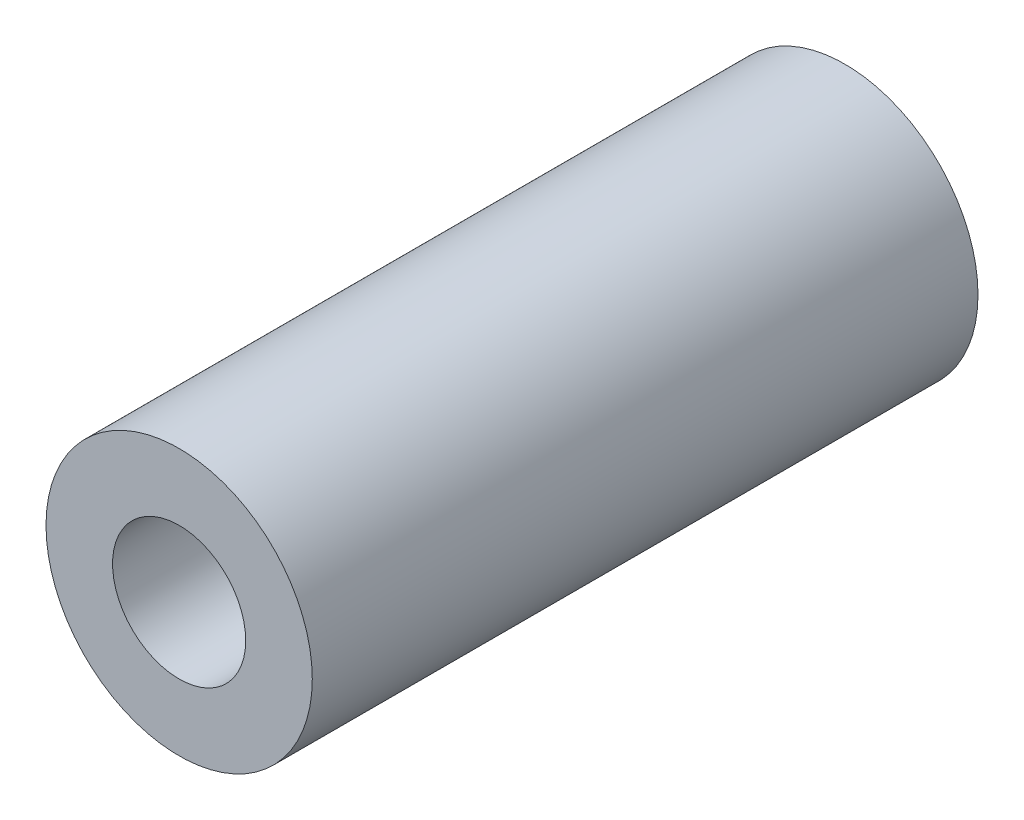
ISO-10303-21;
HEADER;
FILE_DESCRIPTION(('STEP AP214'),'2;1');
FILE_NAME('part.step','',(''),(''),'','','');
FILE_SCHEMA(('AUTOMOTIVE_DESIGN { 1 0 10303 214 1 1 1 1 }'));
ENDSEC;
DATA;
#1=APPLICATION_CONTEXT('core data for automotive mechanical design processes');
#2=APPLICATION_PROTOCOL_DEFINITION('international standard','automotive_design',2000,#1);
#3=PRODUCT_CONTEXT('',#1,'mechanical');
#4=PRODUCT('Part','Part','',(#3));
#5=PRODUCT_RELATED_PRODUCT_CATEGORY('part','',(#4));
#6=PRODUCT_DEFINITION_FORMATION('','',#4);
#7=PRODUCT_DEFINITION_CONTEXT('part definition',#1,'design');
#8=PRODUCT_DEFINITION('design','',#6,#7);
#9=PRODUCT_DEFINITION_SHAPE('','',#8);
#10=(LENGTH_UNIT() NAMED_UNIT(*) SI_UNIT(.MILLI.,.METRE.));
#11=(NAMED_UNIT(*) PLANE_ANGLE_UNIT() SI_UNIT($,.RADIAN.));
#12=(NAMED_UNIT(*) SI_UNIT($,.STERADIAN.) SOLID_ANGLE_UNIT());
#13=UNCERTAINTY_MEASURE_WITH_UNIT(LENGTH_MEASURE(1.E-05),#10,'distance_accuracy_value','');
#14=(GEOMETRIC_REPRESENTATION_CONTEXT(3) GLOBAL_UNCERTAINTY_ASSIGNED_CONTEXT((#13)) GLOBAL_UNIT_ASSIGNED_CONTEXT((#10,
#11,#12)) REPRESENTATION_CONTEXT('',''));
#15=CARTESIAN_POINT('',(0.,0.,0.));
#16=DIRECTION('',(0.,0.,1.));
#17=DIRECTION('',(1.,0.,0.));
#18=AXIS2_PLACEMENT_3D('',#15,#16,#17);
#19=CARTESIAN_POINT('',(0.,0.,10.));
#20=DIRECTION('',(0.,0.,1.));
#21=DIRECTION('',(1.,0.,0.));
#22=AXIS2_PLACEMENT_3D('',#19,#20,#21);
#23=PLANE('',#22);
#24=CARTESIAN_POINT('',(0.,0.,10.));
#25=DIRECTION('',(0.,0.,1.));
#26=DIRECTION('',(1.,0.,0.));
#27=AXIS2_PLACEMENT_3D('',#24,#25,#26);
#28=CIRCLE('',#27,4.);
#29=CARTESIAN_POINT('',(4.,0.,10.));
#30=VERTEX_POINT('',#29);
#31=EDGE_CURVE('E10',#30,#30,#28,.T.);
#32=ORIENTED_EDGE('',*,*,#31,.T.);
#33=EDGE_LOOP('',(#32));
#34=FACE_BOUND('',#33,.T.);
#35=CARTESIAN_POINT('',(0.,0.,10.));
#36=DIRECTION('',(0.,0.,1.));
#37=DIRECTION('',(1.,0.,0.));
#38=AXIS2_PLACEMENT_3D('',#35,#36,#37);
#39=CIRCLE('',#38,2.);
#40=CARTESIAN_POINT('',(2.,0.,10.));
#41=VERTEX_POINT('',#40);
#42=EDGE_CURVE('E42',#41,#41,#39,.T.);
#43=ORIENTED_EDGE('',*,*,#42,.F.);
#44=EDGE_LOOP('',(#43));
#45=FACE_BOUND('',#44,.T.);
#46=ADVANCED_FACE('F31',(#34,#45),#23,.T.);
#47=CARTESIAN_POINT('',(0.,0.,-10.));
#48=DIRECTION('',(0.,0.,1.));
#49=DIRECTION('',(1.,0.,0.));
#50=AXIS2_PLACEMENT_3D('',#47,#48,#49);
#51=PLANE('',#50);
#52=CARTESIAN_POINT('',(0.,0.,-10.));
#53=DIRECTION('',(0.,0.,1.));
#54=DIRECTION('',(1.,0.,0.));
#55=AXIS2_PLACEMENT_3D('',#52,#53,#54);
#56=CIRCLE('',#55,4.);
#57=CARTESIAN_POINT('',(4.,0.,-10.));
#58=VERTEX_POINT('',#57);
#59=EDGE_CURVE('E35',#58,#58,#56,.T.);
#60=ORIENTED_EDGE('',*,*,#59,.F.);
#61=EDGE_LOOP('',(#60));
#62=FACE_BOUND('',#61,.T.);
#63=CARTESIAN_POINT('',(0.,0.,-10.));
#64=DIRECTION('',(0.,0.,1.));
#65=DIRECTION('',(1.,0.,0.));
#66=AXIS2_PLACEMENT_3D('',#63,#64,#65);
#67=CIRCLE('',#66,2.);
#68=CARTESIAN_POINT('',(2.,0.,-10.));
#69=VERTEX_POINT('',#68);
#70=EDGE_CURVE('E44',#69,#69,#67,.T.);
#71=ORIENTED_EDGE('',*,*,#70,.T.);
#72=EDGE_LOOP('',(#71));
#73=FACE_BOUND('',#72,.T.);
#74=ADVANCED_FACE('F54',(#62,#73),#51,.F.);
#75=CARTESIAN_POINT('',(0.,0.,10.));
#76=DIRECTION('',(0.,0.,-1.));
#77=DIRECTION('',(-1.,0.,0.));
#78=AXIS2_PLACEMENT_3D('',#75,#76,#77);
#79=CYLINDRICAL_SURFACE('',#78,4.);
#80=ORIENTED_EDGE('',*,*,#31,.F.);
#81=EDGE_LOOP('',(#80));
#82=FACE_BOUND('',#81,.T.);
#83=ORIENTED_EDGE('',*,*,#59,.T.);
#84=EDGE_LOOP('',(#83));
#85=FACE_BOUND('',#84,.T.);
#86=ADVANCED_FACE('F33',(#82,#85),#79,.T.);
#87=CARTESIAN_POINT('',(0.,0.,10.));
#88=DIRECTION('',(0.,0.,-1.));
#89=DIRECTION('',(-1.,0.,0.));
#90=AXIS2_PLACEMENT_3D('',#87,#88,#89);
#91=CYLINDRICAL_SURFACE('',#90,2.);
#92=ORIENTED_EDGE('',*,*,#42,.T.);
#93=EDGE_LOOP('',(#92));
#94=FACE_BOUND('',#93,.T.);
#95=ORIENTED_EDGE('',*,*,#70,.F.);
#96=EDGE_LOOP('',(#95));
#97=FACE_BOUND('',#96,.T.);
#98=ADVANCED_FACE('F50',(#94,#97),#91,.F.);
#99=CLOSED_SHELL('',(#46,#74,#86,#98));
#100=MANIFOLD_SOLID_BREP('B2',#99);
#101=ADVANCED_BREP_SHAPE_REPRESENTATION('',(#18,#100),#14);
#102=SHAPE_DEFINITION_REPRESENTATION(#9,#101);
ENDSEC;
END-ISO-10303-21;
